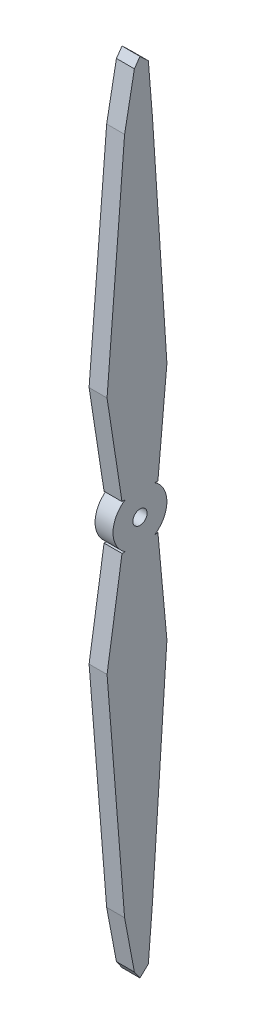
ISO-10303-21;
HEADER;
FILE_DESCRIPTION(('STEP AP214'),'2;1');
FILE_NAME('part.step','',(''),(''),'','','');
FILE_SCHEMA(('AUTOMOTIVE_DESIGN { 1 0 10303 214 1 1 1 1 }'));
ENDSEC;
DATA;
#1=APPLICATION_CONTEXT('core data for automotive mechanical design processes');
#2=APPLICATION_PROTOCOL_DEFINITION('international standard','automotive_design',2000,#1);
#3=PRODUCT_CONTEXT('',#1,'mechanical');
#4=PRODUCT('Part','Part','',(#3));
#5=PRODUCT_RELATED_PRODUCT_CATEGORY('part','',(#4));
#6=PRODUCT_DEFINITION_FORMATION('','',#4);
#7=PRODUCT_DEFINITION_CONTEXT('part definition',#1,'design');
#8=PRODUCT_DEFINITION('design','',#6,#7);
#9=PRODUCT_DEFINITION_SHAPE('','',#8);
#10=(LENGTH_UNIT() NAMED_UNIT(*) SI_UNIT(.MILLI.,.METRE.));
#11=(NAMED_UNIT(*) PLANE_ANGLE_UNIT() SI_UNIT($,.RADIAN.));
#12=(NAMED_UNIT(*) SI_UNIT($,.STERADIAN.) SOLID_ANGLE_UNIT());
#13=UNCERTAINTY_MEASURE_WITH_UNIT(LENGTH_MEASURE(1.E-05),#10,'distance_accuracy_value','');
#14=(GEOMETRIC_REPRESENTATION_CONTEXT(3) GLOBAL_UNCERTAINTY_ASSIGNED_CONTEXT((#13)) GLOBAL_UNIT_ASSIGNED_CONTEXT((#10,
#11,#12)) REPRESENTATION_CONTEXT('',''));
#15=CARTESIAN_POINT('',(0.,0.,0.));
#16=DIRECTION('',(0.,0.,1.));
#17=DIRECTION('',(1.,0.,0.));
#18=AXIS2_PLACEMENT_3D('',#15,#16,#17);
#19=CARTESIAN_POINT('',(-8.,0.,0.));
#20=DIRECTION('',(1.,0.,0.));
#21=DIRECTION('',(0.,0.,-1.));
#22=AXIS2_PLACEMENT_3D('',#19,#20,#21);
#23=CYLINDRICAL_SURFACE('',#22,12.);
#24=DIRECTION('',(1.,0.,0.));
#25=VECTOR('',#24,1.);
#26=CARTESIAN_POINT('',(-8.,-10.,6.6332495807108));
#27=LINE('',#26,#25);
#28=CARTESIAN_POINT('',(0.,-10.,6.6332495807108));
#29=VERTEX_POINT('',#28);
#30=CARTESIAN_POINT('',(-8.,-10.,6.6332495807108));
#31=VERTEX_POINT('',#30);
#32=EDGE_CURVE('E11',#29,#31,#27,.F.);
#33=ORIENTED_EDGE('',*,*,#32,.F.);
#34=CARTESIAN_POINT('',(0.,0.,0.));
#35=DIRECTION('',(1.,0.,0.));
#36=DIRECTION('',(0.,0.,-1.));
#37=AXIS2_PLACEMENT_3D('',#34,#35,#36);
#38=CIRCLE('',#37,12.);
#39=CARTESIAN_POINT('',(0.,10.,6.6332495807108));
#40=VERTEX_POINT('',#39);
#41=EDGE_CURVE('E259',#40,#29,#38,.T.);
#42=ORIENTED_EDGE('',*,*,#41,.F.);
#43=DIRECTION('',(1.,0.,0.));
#44=VECTOR('',#43,1.);
#45=CARTESIAN_POINT('',(-8.,10.,6.6332495807108));
#46=LINE('',#45,#44);
#47=CARTESIAN_POINT('',(-8.,10.,6.6332495807108));
#48=VERTEX_POINT('',#47);
#49=EDGE_CURVE('E257',#40,#48,#46,.F.);
#50=ORIENTED_EDGE('',*,*,#49,.T.);
#51=CARTESIAN_POINT('',(-8.,0.,0.));
#52=DIRECTION('',(1.,0.,0.));
#53=DIRECTION('',(0.,0.,-1.));
#54=AXIS2_PLACEMENT_3D('',#51,#52,#53);
#55=CIRCLE('',#54,12.);
#56=EDGE_CURVE('E254',#48,#31,#55,.T.);
#57=ORIENTED_EDGE('',*,*,#56,.T.);
#58=EDGE_LOOP('',(#33,#42,#50,#57));
#59=FACE_BOUND('',#58,.T.);
#60=ADVANCED_FACE('F39',(#59),#23,.T.);
#61=CARTESIAN_POINT('',(-8.,10.,-8.001));
#62=DIRECTION('',(0.,-1.,0.));
#63=DIRECTION('',(0.,0.,-1.));
#64=AXIS2_PLACEMENT_3D('',#61,#62,#63);
#65=PLANE('',#64);
#66=DIRECTION('',(1.,0.,0.));
#67=VECTOR('',#66,1.);
#68=CARTESIAN_POINT('',(-8.,10.,-6.6332495807108));
#69=LINE('',#68,#67);
#70=CARTESIAN_POINT('',(-8.,10.,-6.6332495807108));
#71=VERTEX_POINT('',#70);
#72=CARTESIAN_POINT('',(0.,10.,-6.6332495807108));
#73=VERTEX_POINT('',#72);
#74=EDGE_CURVE('E262',#71,#73,#69,.T.);
#75=ORIENTED_EDGE('',*,*,#74,.F.);
#76=DIRECTION('',(0.,0.,-1.));
#77=VECTOR('',#76,1.);
#78=CARTESIAN_POINT('',(-8.,10.,-8.001));
#79=LINE('',#78,#77);
#80=CARTESIAN_POINT('',(-8.,10.,-8.001));
#81=VERTEX_POINT('',#80);
#82=EDGE_CURVE('E269',#71,#81,#79,.T.);
#83=ORIENTED_EDGE('',*,*,#82,.T.);
#84=DIRECTION('',(1.,0.,0.));
#85=VECTOR('',#84,1.);
#86=CARTESIAN_POINT('',(-8.,10.,-8.001));
#87=LINE('',#86,#85);
#88=CARTESIAN_POINT('',(0.,10.,-8.001));
#89=VERTEX_POINT('',#88);
#90=EDGE_CURVE('E293',#81,#89,#87,.T.);
#91=ORIENTED_EDGE('',*,*,#90,.T.);
#92=DIRECTION('',(0.,0.,-1.));
#93=VECTOR('',#92,1.);
#94=CARTESIAN_POINT('',(0.,10.,-8.001));
#95=LINE('',#94,#93);
#96=EDGE_CURVE('E264',#73,#89,#95,.T.);
#97=ORIENTED_EDGE('',*,*,#96,.F.);
#98=EDGE_LOOP('',(#75,#83,#91,#97));
#99=FACE_BOUND('',#98,.T.);
#100=ADVANCED_FACE('F344',(#99),#65,.T.);
#101=ORIENTED_EDGE('',*,*,#49,.F.);
#102=CARTESIAN_POINT('',(0.,10.,8.001));
#103=VERTEX_POINT('',#102);
#104=EDGE_CURVE('E294',#103,#40,#95,.T.);
#105=ORIENTED_EDGE('',*,*,#104,.F.);
#106=DIRECTION('',(1.,0.,0.));
#107=VECTOR('',#106,1.);
#108=CARTESIAN_POINT('',(-8.,10.,8.001));
#109=LINE('',#108,#107);
#110=CARTESIAN_POINT('',(-8.,10.,8.001));
#111=VERTEX_POINT('',#110);
#112=EDGE_CURVE('E321',#111,#103,#109,.T.);
#113=ORIENTED_EDGE('',*,*,#112,.F.);
#114=EDGE_CURVE('E265',#111,#48,#79,.T.);
#115=ORIENTED_EDGE('',*,*,#114,.T.);
#116=EDGE_LOOP('',(#101,#105,#113,#115));
#117=FACE_BOUND('',#116,.T.);
#118=ADVANCED_FACE('F41',(#117),#65,.T.);
#119=CARTESIAN_POINT('',(-8.,10.,8.001));
#120=DIRECTION('',(0.,-0.152052900060362,0.988372356747817));
#121=DIRECTION('',(0.,-0.988372356747817,-0.152052900060362));
#122=AXIS2_PLACEMENT_3D('',#119,#120,#121);
#123=PLANE('',#122);
#124=DIRECTION('',(0.,-0.988372356747817,-0.152052900060362));
#125=VECTOR('',#124,1.);
#126=CARTESIAN_POINT('',(0.,10.,8.001));
#127=LINE('',#126,#125);
#128=CARTESIAN_POINT('',(0.,53.34,14.6685));
#129=VERTEX_POINT('',#128);
#130=EDGE_CURVE('E318',#129,#103,#127,.T.);
#131=ORIENTED_EDGE('',*,*,#130,.F.);
#132=DIRECTION('',(1.,0.,0.));
#133=VECTOR('',#132,1.);
#134=CARTESIAN_POINT('',(-8.,53.34,14.6685));
#135=LINE('',#134,#133);
#136=CARTESIAN_POINT('',(-8.,53.34,14.6685));
#137=VERTEX_POINT('',#136);
#138=EDGE_CURVE('E323',#137,#129,#135,.T.);
#139=ORIENTED_EDGE('',*,*,#138,.F.);
#140=DIRECTION('',(0.,-0.988372356747817,-0.152052900060362));
#141=VECTOR('',#140,1.);
#142=CARTESIAN_POINT('',(-8.,10.,8.001));
#143=LINE('',#142,#141);
#144=EDGE_CURVE('E290',#137,#111,#143,.T.);
#145=ORIENTED_EDGE('',*,*,#144,.T.);
#146=ORIENTED_EDGE('',*,*,#112,.T.);
#147=EDGE_LOOP('',(#131,#139,#145,#146));
#148=FACE_BOUND('',#147,.T.);
#149=ADVANCED_FACE('F375',(#148),#123,.T.);
#150=CARTESIAN_POINT('',(-8.,53.34,14.6685));
#151=DIRECTION('',(0.,0.07974522228289,0.996815278536125));
#152=DIRECTION('',(0.,-0.996815278536125,0.07974522228289));
#153=AXIS2_PLACEMENT_3D('',#150,#151,#152);
#154=PLANE('',#153);
#155=DIRECTION('',(0.,-0.996815278536125,0.07974522228289));
#156=VECTOR('',#155,1.);
#157=CARTESIAN_POINT('',(0.,53.34,14.6685));
#158=LINE('',#157,#156);
#159=CARTESIAN_POINT('',(0.,151.13,6.8453));
#160=VERTEX_POINT('',#159);
#161=EDGE_CURVE('E315',#160,#129,#158,.T.);
#162=ORIENTED_EDGE('',*,*,#161,.F.);
#163=DIRECTION('',(1.,0.,0.));
#164=VECTOR('',#163,1.);
#165=CARTESIAN_POINT('',(-8.,151.13,6.8453));
#166=LINE('',#165,#164);
#167=CARTESIAN_POINT('',(-8.,151.13,6.8453));
#168=VERTEX_POINT('',#167);
#169=EDGE_CURVE('E325',#168,#160,#166,.T.);
#170=ORIENTED_EDGE('',*,*,#169,.F.);
#171=DIRECTION('',(0.,-0.996815278536125,0.07974522228289));
#172=VECTOR('',#171,1.);
#173=CARTESIAN_POINT('',(-8.,53.34,14.6685));
#174=LINE('',#173,#172);
#175=EDGE_CURVE('E287',#168,#137,#174,.T.);
#176=ORIENTED_EDGE('',*,*,#175,.T.);
#177=ORIENTED_EDGE('',*,*,#138,.T.);
#178=EDGE_LOOP('',(#162,#170,#176,#177));
#179=FACE_BOUND('',#178,.T.);
#180=ADVANCED_FACE('F372',(#179),#154,.T.);
#181=CARTESIAN_POINT('',(-8.,151.13,6.8453));
#182=DIRECTION('',(0.,0.185201268913039,0.982700610558984));
#183=DIRECTION('',(0.,-0.982700610558984,0.185201268913039));
#184=AXIS2_PLACEMENT_3D('',#181,#182,#183);
#185=PLANE('',#184);
#186=DIRECTION('',(0.,-0.982700610558984,0.185201268913039));
#187=VECTOR('',#186,1.);
#188=CARTESIAN_POINT('',(0.,151.13,6.8453));
#189=LINE('',#188,#187);
#190=CARTESIAN_POINT('',(0.,174.244,2.4892));
#191=VERTEX_POINT('',#190);
#192=EDGE_CURVE('E312',#191,#160,#189,.T.);
#193=ORIENTED_EDGE('',*,*,#192,.F.);
#194=DIRECTION('',(1.,0.,0.));
#195=VECTOR('',#194,1.);
#196=CARTESIAN_POINT('',(-8.,174.244,2.4892));
#197=LINE('',#196,#195);
#198=CARTESIAN_POINT('',(-8.,174.244,2.4892));
#199=VERTEX_POINT('',#198);
#200=EDGE_CURVE('E327',#199,#191,#197,.T.);
#201=ORIENTED_EDGE('',*,*,#200,.F.);
#202=DIRECTION('',(0.,-0.982700610558984,0.185201268913039));
#203=VECTOR('',#202,1.);
#204=CARTESIAN_POINT('',(-8.,151.13,6.8453));
#205=LINE('',#204,#203);
#206=EDGE_CURVE('E284',#199,#168,#205,.T.);
#207=ORIENTED_EDGE('',*,*,#206,.T.);
#208=ORIENTED_EDGE('',*,*,#169,.T.);
#209=EDGE_LOOP('',(#193,#201,#207,#208));
#210=FACE_BOUND('',#209,.T.);
#211=ADVANCED_FACE('F368',(#210),#185,.T.);
#212=CARTESIAN_POINT('',(-8.,174.244,2.4892));
#213=DIRECTION('',(0.,0.573462344363328,0.819231920519041));
#214=DIRECTION('',(0.,-0.819231920519041,0.573462344363328));
#215=AXIS2_PLACEMENT_3D('',#212,#213,#214);
#216=PLANE('',#215);
#217=DIRECTION('',(0.,-0.819231920519041,0.573462344363328));
#218=VECTOR('',#217,1.);
#219=CARTESIAN_POINT('',(0.,174.244,2.4892));
#220=LINE('',#219,#218);
#221=CARTESIAN_POINT('',(0.,177.8,0.));
#222=VERTEX_POINT('',#221);
#223=EDGE_CURVE('E309',#222,#191,#220,.T.);
#224=ORIENTED_EDGE('',*,*,#223,.F.);
#225=DIRECTION('',(1.,0.,0.));
#226=VECTOR('',#225,1.);
#227=CARTESIAN_POINT('',(-8.,177.8,0.));
#228=LINE('',#227,#226);
#229=CARTESIAN_POINT('',(-8.,177.8,0.));
#230=VERTEX_POINT('',#229);
#231=EDGE_CURVE('E329',#230,#222,#228,.T.);
#232=ORIENTED_EDGE('',*,*,#231,.F.);
#233=DIRECTION('',(0.,-0.819231920519041,0.573462344363328));
#234=VECTOR('',#233,1.);
#235=CARTESIAN_POINT('',(-8.,174.244,2.4892));
#236=LINE('',#235,#234);
#237=EDGE_CURVE('E281',#230,#199,#236,.T.);
#238=ORIENTED_EDGE('',*,*,#237,.T.);
#239=ORIENTED_EDGE('',*,*,#200,.T.);
#240=EDGE_LOOP('',(#224,#232,#238,#239));
#241=FACE_BOUND('',#240,.T.);
#242=ADVANCED_FACE('F364',(#241),#216,.T.);
#243=CARTESIAN_POINT('',(-8.,177.8,0.));
#244=DIRECTION('',(0.,0.724137931034483,-0.689655172413793));
#245=DIRECTION('',(0.,0.689655172413793,0.724137931034483));
#246=AXIS2_PLACEMENT_3D('',#243,#244,#245);
#247=PLANE('',#246);
#248=DIRECTION('',(0.,0.689655172413793,0.724137931034482));
#249=VECTOR('',#248,1.);
#250=CARTESIAN_POINT('',(0.,177.8,0.));
#251=LINE('',#250,#249);
#252=CARTESIAN_POINT('',(0.,174.244,-3.7338));
#253=VERTEX_POINT('',#252);
#254=EDGE_CURVE('E306',#253,#222,#251,.T.);
#255=ORIENTED_EDGE('',*,*,#254,.F.);
#256=DIRECTION('',(1.,0.,0.));
#257=VECTOR('',#256,1.);
#258=CARTESIAN_POINT('',(-8.,174.244,-3.7338));
#259=LINE('',#258,#257);
#260=CARTESIAN_POINT('',(-8.,174.244,-3.7338));
#261=VERTEX_POINT('',#260);
#262=EDGE_CURVE('E331',#261,#253,#259,.T.);
#263=ORIENTED_EDGE('',*,*,#262,.F.);
#264=DIRECTION('',(0.,0.689655172413793,0.724137931034482));
#265=VECTOR('',#264,1.);
#266=CARTESIAN_POINT('',(-8.,177.8,0.));
#267=LINE('',#266,#265);
#268=EDGE_CURVE('E278',#261,#230,#267,.T.);
#269=ORIENTED_EDGE('',*,*,#268,.T.);
#270=ORIENTED_EDGE('',*,*,#231,.T.);
#271=EDGE_LOOP('',(#255,#263,#269,#270));
#272=FACE_BOUND('',#271,.T.);
#273=ADVANCED_FACE('F360',(#272),#247,.T.);
#274=CARTESIAN_POINT('',(-8.,174.244,-3.7338));
#275=DIRECTION('',(0.,0.0805070569764701,-0.996754038756296));
#276=DIRECTION('',(0.,0.996754038756296,0.0805070569764701));
#277=AXIS2_PLACEMENT_3D('',#274,#275,#276);
#278=PLANE('',#277);
#279=DIRECTION('',(0.,0.996754038756296,0.0805070569764701));
#280=VECTOR('',#279,1.);
#281=CARTESIAN_POINT('',(0.,174.244,-3.7338));
#282=LINE('',#281,#280);
#283=CARTESIAN_POINT('',(0.,151.13,-5.6007));
#284=VERTEX_POINT('',#283);
#285=EDGE_CURVE('E303',#284,#253,#282,.T.);
#286=ORIENTED_EDGE('',*,*,#285,.F.);
#287=DIRECTION('',(1.,0.,0.));
#288=VECTOR('',#287,1.);
#289=CARTESIAN_POINT('',(-8.,151.13,-5.6007));
#290=LINE('',#289,#288);
#291=CARTESIAN_POINT('',(-8.,151.13,-5.6007));
#292=VERTEX_POINT('',#291);
#293=EDGE_CURVE('E333',#292,#284,#290,.T.);
#294=ORIENTED_EDGE('',*,*,#293,.F.);
#295=DIRECTION('',(0.,0.996754038756296,0.0805070569764701));
#296=VECTOR('',#295,1.);
#297=CARTESIAN_POINT('',(-8.,174.244,-3.7338));
#298=LINE('',#297,#296);
#299=EDGE_CURVE('E275',#292,#261,#298,.T.);
#300=ORIENTED_EDGE('',*,*,#299,.T.);
#301=ORIENTED_EDGE('',*,*,#262,.T.);
#302=EDGE_LOOP('',(#286,#294,#300,#301));
#303=FACE_BOUND('',#302,.T.);
#304=ADVANCED_FACE('F356',(#303),#278,.T.);
#305=CARTESIAN_POINT('',(-8.,151.13,-5.6007));
#306=DIRECTION('',(0.,0.0653147810154766,-0.99786470995867));
#307=DIRECTION('',(0.,0.99786470995867,0.0653147810154766));
#308=AXIS2_PLACEMENT_3D('',#305,#306,#307);
#309=PLANE('',#308);
#310=DIRECTION('',(0.,0.99786470995867,0.0653147810154766));
#311=VECTOR('',#310,1.);
#312=CARTESIAN_POINT('',(0.,151.13,-5.6007));
#313=LINE('',#312,#311);
#314=CARTESIAN_POINT('',(0.,53.34,-12.0015));
#315=VERTEX_POINT('',#314);
#316=EDGE_CURVE('E300',#315,#284,#313,.T.);
#317=ORIENTED_EDGE('',*,*,#316,.F.);
#318=DIRECTION('',(1.,0.,0.));
#319=VECTOR('',#318,1.);
#320=CARTESIAN_POINT('',(-8.,53.34,-12.0015));
#321=LINE('',#320,#319);
#322=CARTESIAN_POINT('',(-8.,53.34,-12.0015));
#323=VERTEX_POINT('',#322);
#324=EDGE_CURVE('E335',#323,#315,#321,.T.);
#325=ORIENTED_EDGE('',*,*,#324,.F.);
#326=DIRECTION('',(0.,0.99786470995867,0.0653147810154766));
#327=VECTOR('',#326,1.);
#328=CARTESIAN_POINT('',(-8.,151.13,-5.6007));
#329=LINE('',#328,#327);
#330=EDGE_CURVE('E272',#323,#292,#329,.T.);
#331=ORIENTED_EDGE('',*,*,#330,.T.);
#332=ORIENTED_EDGE('',*,*,#293,.T.);
#333=EDGE_LOOP('',(#317,#325,#331,#332));
#334=FACE_BOUND('',#333,.T.);
#335=ADVANCED_FACE('F352',(#334),#309,.T.);
#336=CARTESIAN_POINT('',(-8.,53.34,-12.0015));
#337=DIRECTION('',(0.,-0.0919142955721114,-0.995766921658619));
#338=DIRECTION('',(0.,0.995766921658619,-0.0919142955721114));
#339=AXIS2_PLACEMENT_3D('',#336,#337,#338);
#340=PLANE('',#339);
#341=DIRECTION('',(0.,0.995766921658619,-0.0919142955721114));
#342=VECTOR('',#341,1.);
#343=CARTESIAN_POINT('',(0.,53.34,-12.0015));
#344=LINE('',#343,#342);
#345=EDGE_CURVE('E297',#89,#315,#344,.T.);
#346=ORIENTED_EDGE('',*,*,#345,.F.);
#347=ORIENTED_EDGE('',*,*,#90,.F.);
#348=DIRECTION('',(0.,0.995766921658619,-0.0919142955721114));
#349=VECTOR('',#348,1.);
#350=CARTESIAN_POINT('',(-8.,53.34,-12.0015));
#351=LINE('',#350,#349);
#352=EDGE_CURVE('E268',#81,#323,#351,.T.);
#353=ORIENTED_EDGE('',*,*,#352,.T.);
#354=ORIENTED_EDGE('',*,*,#324,.T.);
#355=EDGE_LOOP('',(#346,#347,#353,#354));
#356=FACE_BOUND('',#355,.T.);
#357=ADVANCED_FACE('F348',(#356),#340,.T.);
#358=CARTESIAN_POINT('',(-8.,0.,0.));
#359=DIRECTION('',(1.,0.,0.));
#360=DIRECTION('',(0.,0.,-1.));
#361=AXIS2_PLACEMENT_3D('',#358,#359,#360);
#362=PLANE('',#361);
#363=CARTESIAN_POINT('',(-8.,0.,0.));
#364=DIRECTION('',(1.,0.,0.));
#365=DIRECTION('',(0.,0.,-1.));
#366=AXIS2_PLACEMENT_3D('',#363,#364,#365);
#367=CIRCLE('',#366,3.175);
#368=CARTESIAN_POINT('',(-8.,0.,-3.175));
#369=VERTEX_POINT('',#368);
#370=EDGE_CURVE('E404',#369,#369,#367,.T.);
#371=ORIENTED_EDGE('',*,*,#370,.T.);
#372=EDGE_LOOP('',(#371));
#373=FACE_BOUND('',#372,.T.);
#374=CARTESIAN_POINT('',(-8.,-10.,-6.6332495807108));
#375=VERTEX_POINT('',#374);
#376=EDGE_CURVE('E258',#375,#71,#55,.T.);
#377=ORIENTED_EDGE('',*,*,#376,.F.);
#378=DIRECTION('',(0.,0.,1.));
#379=VECTOR('',#378,1.);
#380=CARTESIAN_POINT('',(-8.,-10.,-8.001));
#381=LINE('',#380,#379);
#382=CARTESIAN_POINT('',(-8.,-10.,-8.001));
#383=VERTEX_POINT('',#382);
#384=EDGE_CURVE('E207',#383,#375,#381,.T.);
#385=ORIENTED_EDGE('',*,*,#384,.F.);
#386=DIRECTION('',(0.,0.995766921658619,0.0919142955721114));
#387=VECTOR('',#386,1.);
#388=CARTESIAN_POINT('',(-8.,-53.34,-12.0015));
#389=LINE('',#388,#387);
#390=CARTESIAN_POINT('',(-8.,-53.34,-12.0015));
#391=VERTEX_POINT('',#390);
#392=EDGE_CURVE('E192',#391,#383,#389,.T.);
#393=ORIENTED_EDGE('',*,*,#392,.F.);
#394=DIRECTION('',(0.,0.99786470995867,-0.0653147810154766));
#395=VECTOR('',#394,1.);
#396=CARTESIAN_POINT('',(-8.,-151.13,-5.6007));
#397=LINE('',#396,#395);
#398=CARTESIAN_POINT('',(-8.,-151.13,-5.6007));
#399=VERTEX_POINT('',#398);
#400=EDGE_CURVE('E232',#399,#391,#397,.T.);
#401=ORIENTED_EDGE('',*,*,#400,.F.);
#402=DIRECTION('',(0.,0.996754038756296,-0.0805070569764701));
#403=VECTOR('',#402,1.);
#404=CARTESIAN_POINT('',(-8.,-174.244,-3.7338));
#405=LINE('',#404,#403);
#406=CARTESIAN_POINT('',(-8.,-174.244,-3.7338));
#407=VERTEX_POINT('',#406);
#408=EDGE_CURVE('E236',#407,#399,#405,.T.);
#409=ORIENTED_EDGE('',*,*,#408,.F.);
#410=DIRECTION('',(0.,0.689655172413793,-0.724137931034482));
#411=VECTOR('',#410,1.);
#412=CARTESIAN_POINT('',(-8.,-177.8,0.));
#413=LINE('',#412,#411);
#414=CARTESIAN_POINT('',(-8.,-177.8,0.));
#415=VERTEX_POINT('',#414);
#416=EDGE_CURVE('E239',#415,#407,#413,.T.);
#417=ORIENTED_EDGE('',*,*,#416,.F.);
#418=DIRECTION('',(0.,-0.819231920519041,-0.573462344363328));
#419=VECTOR('',#418,1.);
#420=CARTESIAN_POINT('',(-8.,-174.244,2.4892));
#421=LINE('',#420,#419);
#422=CARTESIAN_POINT('',(-8.,-174.244,2.4892));
#423=VERTEX_POINT('',#422);
#424=EDGE_CURVE('E242',#423,#415,#421,.T.);
#425=ORIENTED_EDGE('',*,*,#424,.F.);
#426=DIRECTION('',(0.,-0.982700610558984,-0.185201268913039));
#427=VECTOR('',#426,1.);
#428=CARTESIAN_POINT('',(-8.,-151.13,6.8453));
#429=LINE('',#428,#427);
#430=CARTESIAN_POINT('',(-8.,-151.13,6.8453));
#431=VERTEX_POINT('',#430);
#432=EDGE_CURVE('E245',#431,#423,#429,.T.);
#433=ORIENTED_EDGE('',*,*,#432,.F.);
#434=DIRECTION('',(0.,-0.996815278536125,-0.07974522228289));
#435=VECTOR('',#434,1.);
#436=CARTESIAN_POINT('',(-8.,-53.34,14.6685));
#437=LINE('',#436,#435);
#438=CARTESIAN_POINT('',(-8.,-53.34,14.6685));
#439=VERTEX_POINT('',#438);
#440=EDGE_CURVE('E248',#439,#431,#437,.T.);
#441=ORIENTED_EDGE('',*,*,#440,.F.);
#442=DIRECTION('',(0.,-0.988372356747817,0.152052900060362));
#443=VECTOR('',#442,1.);
#444=CARTESIAN_POINT('',(-8.,-10.,8.001));
#445=LINE('',#444,#443);
#446=CARTESIAN_POINT('',(-8.,-10.,8.001));
#447=VERTEX_POINT('',#446);
#448=EDGE_CURVE('E251',#447,#439,#445,.T.);
#449=ORIENTED_EDGE('',*,*,#448,.F.);
#450=EDGE_CURVE('E211',#31,#447,#381,.T.);
#451=ORIENTED_EDGE('',*,*,#450,.F.);
#452=ORIENTED_EDGE('',*,*,#56,.F.);
#453=ORIENTED_EDGE('',*,*,#114,.F.);
#454=ORIENTED_EDGE('',*,*,#144,.F.);
#455=ORIENTED_EDGE('',*,*,#175,.F.);
#456=ORIENTED_EDGE('',*,*,#206,.F.);
#457=ORIENTED_EDGE('',*,*,#237,.F.);
#458=ORIENTED_EDGE('',*,*,#268,.F.);
#459=ORIENTED_EDGE('',*,*,#299,.F.);
#460=ORIENTED_EDGE('',*,*,#330,.F.);
#461=ORIENTED_EDGE('',*,*,#352,.F.);
#462=ORIENTED_EDGE('',*,*,#82,.F.);
#463=EDGE_LOOP('',(#377,#385,#393,#401,#409,#417,#425,#433,#441,#449,#451,#452,#453,#454,#455,
#456,#457,#458,#459,#460,#461,#462));
#464=FACE_BOUND('',#463,.T.);
#465=ADVANCED_FACE('F392',(#373,#464),#362,.F.);
#466=CARTESIAN_POINT('',(0.,0.,0.));
#467=DIRECTION('',(1.,0.,0.));
#468=DIRECTION('',(0.,0.,-1.));
#469=AXIS2_PLACEMENT_3D('',#466,#467,#468);
#470=PLANE('',#469);
#471=CARTESIAN_POINT('',(0.,0.,0.));
#472=DIRECTION('',(1.,0.,0.));
#473=DIRECTION('',(0.,0.,-1.));
#474=AXIS2_PLACEMENT_3D('',#471,#472,#473);
#475=CIRCLE('',#474,3.175);
#476=CARTESIAN_POINT('',(0.,0.,-3.175));
#477=VERTEX_POINT('',#476);
#478=EDGE_CURVE('E43',#477,#477,#475,.T.);
#479=ORIENTED_EDGE('',*,*,#478,.F.);
#480=EDGE_LOOP('',(#479));
#481=FACE_BOUND('',#480,.T.);
#482=ORIENTED_EDGE('',*,*,#41,.T.);
#483=DIRECTION('',(0.,0.,1.));
#484=VECTOR('',#483,1.);
#485=CARTESIAN_POINT('',(0.,-10.,-8.001));
#486=LINE('',#485,#484);
#487=CARTESIAN_POINT('',(0.,-10.,8.001));
#488=VERTEX_POINT('',#487);
#489=EDGE_CURVE('E199',#29,#488,#486,.T.);
#490=ORIENTED_EDGE('',*,*,#489,.T.);
#491=DIRECTION('',(0.,-0.988372356747817,0.152052900060362));
#492=VECTOR('',#491,1.);
#493=CARTESIAN_POINT('',(0.,-10.,8.001));
#494=LINE('',#493,#492);
#495=CARTESIAN_POINT('',(0.,-53.34,14.6685));
#496=VERTEX_POINT('',#495);
#497=EDGE_CURVE('E228',#488,#496,#494,.T.);
#498=ORIENTED_EDGE('',*,*,#497,.T.);
#499=DIRECTION('',(0.,-0.996815278536125,-0.07974522228289));
#500=VECTOR('',#499,1.);
#501=CARTESIAN_POINT('',(0.,-53.34,14.6685));
#502=LINE('',#501,#500);
#503=CARTESIAN_POINT('',(0.,-151.13,6.8453));
#504=VERTEX_POINT('',#503);
#505=EDGE_CURVE('E225',#496,#504,#502,.T.);
#506=ORIENTED_EDGE('',*,*,#505,.T.);
#507=DIRECTION('',(0.,-0.982700610558984,-0.185201268913039));
#508=VECTOR('',#507,1.);
#509=CARTESIAN_POINT('',(0.,-151.13,6.8453));
#510=LINE('',#509,#508);
#511=CARTESIAN_POINT('',(0.,-174.244,2.4892));
#512=VERTEX_POINT('',#511);
#513=EDGE_CURVE('E222',#504,#512,#510,.T.);
#514=ORIENTED_EDGE('',*,*,#513,.T.);
#515=DIRECTION('',(0.,-0.819231920519041,-0.573462344363328));
#516=VECTOR('',#515,1.);
#517=CARTESIAN_POINT('',(0.,-174.244,2.4892));
#518=LINE('',#517,#516);
#519=CARTESIAN_POINT('',(0.,-177.8,0.));
#520=VERTEX_POINT('',#519);
#521=EDGE_CURVE('E219',#512,#520,#518,.T.);
#522=ORIENTED_EDGE('',*,*,#521,.T.);
#523=DIRECTION('',(0.,0.689655172413793,-0.724137931034482));
#524=VECTOR('',#523,1.);
#525=CARTESIAN_POINT('',(0.,-177.8,0.));
#526=LINE('',#525,#524);
#527=CARTESIAN_POINT('',(0.,-174.244,-3.7338));
#528=VERTEX_POINT('',#527);
#529=EDGE_CURVE('E216',#520,#528,#526,.T.);
#530=ORIENTED_EDGE('',*,*,#529,.T.);
#531=DIRECTION('',(0.,0.996754038756296,-0.0805070569764701));
#532=VECTOR('',#531,1.);
#533=CARTESIAN_POINT('',(0.,-174.244,-3.7338));
#534=LINE('',#533,#532);
#535=CARTESIAN_POINT('',(0.,-151.13,-5.6007));
#536=VERTEX_POINT('',#535);
#537=EDGE_CURVE('E209',#528,#536,#534,.T.);
#538=ORIENTED_EDGE('',*,*,#537,.T.);
#539=DIRECTION('',(0.,0.99786470995867,-0.0653147810154766));
#540=VECTOR('',#539,1.);
#541=CARTESIAN_POINT('',(0.,-151.13,-5.6007));
#542=LINE('',#541,#540);
#543=CARTESIAN_POINT('',(0.,-53.34,-12.0015));
#544=VERTEX_POINT('',#543);
#545=EDGE_CURVE('E206',#536,#544,#542,.T.);
#546=ORIENTED_EDGE('',*,*,#545,.T.);
#547=DIRECTION('',(0.,0.995766921658619,0.0919142955721114));
#548=VECTOR('',#547,1.);
#549=CARTESIAN_POINT('',(0.,-53.34,-12.0015));
#550=LINE('',#549,#548);
#551=CARTESIAN_POINT('',(0.,-10.,-8.001));
#552=VERTEX_POINT('',#551);
#553=EDGE_CURVE('E190',#544,#552,#550,.T.);
#554=ORIENTED_EDGE('',*,*,#553,.T.);
#555=CARTESIAN_POINT('',(0.,-10.,-6.6332495807108));
#556=VERTEX_POINT('',#555);
#557=EDGE_CURVE('E55',#552,#556,#486,.T.);
#558=ORIENTED_EDGE('',*,*,#557,.T.);
#559=EDGE_CURVE('E60',#556,#73,#38,.T.);
#560=ORIENTED_EDGE('',*,*,#559,.T.);
#561=ORIENTED_EDGE('',*,*,#96,.T.);
#562=ORIENTED_EDGE('',*,*,#345,.T.);
#563=ORIENTED_EDGE('',*,*,#316,.T.);
#564=ORIENTED_EDGE('',*,*,#285,.T.);
#565=ORIENTED_EDGE('',*,*,#254,.T.);
#566=ORIENTED_EDGE('',*,*,#223,.T.);
#567=ORIENTED_EDGE('',*,*,#192,.T.);
#568=ORIENTED_EDGE('',*,*,#161,.T.);
#569=ORIENTED_EDGE('',*,*,#130,.T.);
#570=ORIENTED_EDGE('',*,*,#104,.T.);
#571=EDGE_LOOP('',(#482,#490,#498,#506,#514,#522,#530,#538,#546,#554,#558,#560,#561,#562,#563,
#564,#565,#566,#567,#568,#569,#570));
#572=FACE_BOUND('',#571,.T.);
#573=ADVANCED_FACE('F203',(#481,#572),#470,.T.);
#574=DIRECTION('',(1.,0.,0.));
#575=VECTOR('',#574,1.);
#576=CARTESIAN_POINT('',(-8.,-10.,-6.6332495807108));
#577=LINE('',#576,#575);
#578=EDGE_CURVE('E48',#375,#556,#577,.T.);
#579=ORIENTED_EDGE('',*,*,#578,.F.);
#580=ORIENTED_EDGE('',*,*,#376,.T.);
#581=ORIENTED_EDGE('',*,*,#74,.T.);
#582=ORIENTED_EDGE('',*,*,#559,.F.);
#583=EDGE_LOOP('',(#579,#580,#581,#582));
#584=FACE_BOUND('',#583,.T.);
#585=ADVANCED_FACE('F419',(#584),#23,.T.);
#586=CARTESIAN_POINT('',(-8.,-10.,-8.001));
#587=DIRECTION('',(0.,1.,0.));
#588=DIRECTION('',(0.,0.,1.));
#589=AXIS2_PLACEMENT_3D('',#586,#587,#588);
#590=PLANE('',#589);
#591=ORIENTED_EDGE('',*,*,#489,.F.);
#592=ORIENTED_EDGE('',*,*,#32,.T.);
#593=ORIENTED_EDGE('',*,*,#450,.T.);
#594=DIRECTION('',(1.,0.,0.));
#595=VECTOR('',#594,1.);
#596=CARTESIAN_POINT('',(-8.,-10.,8.001));
#597=LINE('',#596,#595);
#598=EDGE_CURVE('E233',#447,#488,#597,.T.);
#599=ORIENTED_EDGE('',*,*,#598,.T.);
#600=EDGE_LOOP('',(#591,#592,#593,#599));
#601=FACE_BOUND('',#600,.T.);
#602=ADVANCED_FACE('F387',(#601),#590,.T.);
#603=ORIENTED_EDGE('',*,*,#384,.T.);
#604=ORIENTED_EDGE('',*,*,#578,.T.);
#605=ORIENTED_EDGE('',*,*,#557,.F.);
#606=DIRECTION('',(1.,0.,0.));
#607=VECTOR('',#606,1.);
#608=CARTESIAN_POINT('',(-8.,-10.,-8.001));
#609=LINE('',#608,#607);
#610=EDGE_CURVE('E188',#383,#552,#609,.T.);
#611=ORIENTED_EDGE('',*,*,#610,.F.);
#612=EDGE_LOOP('',(#603,#604,#605,#611));
#613=FACE_BOUND('',#612,.T.);
#614=ADVANCED_FACE('F197',(#613),#590,.T.);
#615=CARTESIAN_POINT('',(-8.,-53.34,-12.0015));
#616=DIRECTION('',(0.,0.0919142955721114,-0.995766921658619));
#617=DIRECTION('',(0.,0.995766921658619,0.0919142955721114));
#618=AXIS2_PLACEMENT_3D('',#615,#616,#617);
#619=PLANE('',#618);
#620=ORIENTED_EDGE('',*,*,#553,.F.);
#621=DIRECTION('',(1.,0.,0.));
#622=VECTOR('',#621,1.);
#623=CARTESIAN_POINT('',(-8.,-53.34,-12.0015));
#624=LINE('',#623,#622);
#625=EDGE_CURVE('E195',#391,#544,#624,.T.);
#626=ORIENTED_EDGE('',*,*,#625,.F.);
#627=ORIENTED_EDGE('',*,*,#392,.T.);
#628=ORIENTED_EDGE('',*,*,#610,.T.);
#629=EDGE_LOOP('',(#620,#626,#627,#628));
#630=FACE_BOUND('',#629,.T.);
#631=ADVANCED_FACE('F189',(#630),#619,.T.);
#632=CARTESIAN_POINT('',(-8.,-151.13,-5.6007));
#633=DIRECTION('',(0.,-0.0653147810154766,-0.99786470995867));
#634=DIRECTION('',(0.,0.99786470995867,-0.0653147810154766));
#635=AXIS2_PLACEMENT_3D('',#632,#633,#634);
#636=PLANE('',#635);
#637=ORIENTED_EDGE('',*,*,#545,.F.);
#638=DIRECTION('',(1.,0.,0.));
#639=VECTOR('',#638,1.);
#640=CARTESIAN_POINT('',(-8.,-151.13,-5.6007));
#641=LINE('',#640,#639);
#642=EDGE_CURVE('E413',#399,#536,#641,.T.);
#643=ORIENTED_EDGE('',*,*,#642,.F.);
#644=ORIENTED_EDGE('',*,*,#400,.T.);
#645=ORIENTED_EDGE('',*,*,#625,.T.);
#646=EDGE_LOOP('',(#637,#643,#644,#645));
#647=FACE_BOUND('',#646,.T.);
#648=ADVANCED_FACE('F415',(#647),#636,.T.);
#649=CARTESIAN_POINT('',(-8.,-174.244,-3.7338));
#650=DIRECTION('',(0.,-0.0805070569764701,-0.996754038756296));
#651=DIRECTION('',(0.,0.996754038756296,-0.0805070569764701));
#652=AXIS2_PLACEMENT_3D('',#649,#650,#651);
#653=PLANE('',#652);
#654=ORIENTED_EDGE('',*,*,#537,.F.);
#655=DIRECTION('',(1.,0.,0.));
#656=VECTOR('',#655,1.);
#657=CARTESIAN_POINT('',(-8.,-174.244,-3.7338));
#658=LINE('',#657,#656);
#659=EDGE_CURVE('E411',#407,#528,#658,.T.);
#660=ORIENTED_EDGE('',*,*,#659,.F.);
#661=ORIENTED_EDGE('',*,*,#408,.T.);
#662=ORIENTED_EDGE('',*,*,#642,.T.);
#663=EDGE_LOOP('',(#654,#660,#661,#662));
#664=FACE_BOUND('',#663,.T.);
#665=ADVANCED_FACE('F493',(#664),#653,.T.);
#666=CARTESIAN_POINT('',(-8.,-177.8,0.));
#667=DIRECTION('',(0.,-0.724137931034483,-0.689655172413793));
#668=DIRECTION('',(0.,0.689655172413793,-0.724137931034483));
#669=AXIS2_PLACEMENT_3D('',#666,#667,#668);
#670=PLANE('',#669);
#671=ORIENTED_EDGE('',*,*,#529,.F.);
#672=DIRECTION('',(1.,0.,0.));
#673=VECTOR('',#672,1.);
#674=CARTESIAN_POINT('',(-8.,-177.8,0.));
#675=LINE('',#674,#673);
#676=EDGE_CURVE('E409',#415,#520,#675,.T.);
#677=ORIENTED_EDGE('',*,*,#676,.F.);
#678=ORIENTED_EDGE('',*,*,#416,.T.);
#679=ORIENTED_EDGE('',*,*,#659,.T.);
#680=EDGE_LOOP('',(#671,#677,#678,#679));
#681=FACE_BOUND('',#680,.T.);
#682=ADVANCED_FACE('F489',(#681),#670,.T.);
#683=CARTESIAN_POINT('',(-8.,-174.244,2.4892));
#684=DIRECTION('',(0.,-0.573462344363328,0.819231920519041));
#685=DIRECTION('',(0.,-0.819231920519041,-0.573462344363328));
#686=AXIS2_PLACEMENT_3D('',#683,#684,#685);
#687=PLANE('',#686);
#688=ORIENTED_EDGE('',*,*,#521,.F.);
#689=DIRECTION('',(1.,0.,0.));
#690=VECTOR('',#689,1.);
#691=CARTESIAN_POINT('',(-8.,-174.244,2.4892));
#692=LINE('',#691,#690);
#693=EDGE_CURVE('E407',#423,#512,#692,.T.);
#694=ORIENTED_EDGE('',*,*,#693,.F.);
#695=ORIENTED_EDGE('',*,*,#424,.T.);
#696=ORIENTED_EDGE('',*,*,#676,.T.);
#697=EDGE_LOOP('',(#688,#694,#695,#696));
#698=FACE_BOUND('',#697,.T.);
#699=ADVANCED_FACE('F485',(#698),#687,.T.);
#700=CARTESIAN_POINT('',(-8.,-151.13,6.8453));
#701=DIRECTION('',(0.,-0.185201268913039,0.982700610558984));
#702=DIRECTION('',(0.,-0.982700610558984,-0.185201268913039));
#703=AXIS2_PLACEMENT_3D('',#700,#701,#702);
#704=PLANE('',#703);
#705=ORIENTED_EDGE('',*,*,#513,.F.);
#706=DIRECTION('',(1.,0.,0.));
#707=VECTOR('',#706,1.);
#708=CARTESIAN_POINT('',(-8.,-151.13,6.8453));
#709=LINE('',#708,#707);
#710=EDGE_CURVE('E401',#431,#504,#709,.T.);
#711=ORIENTED_EDGE('',*,*,#710,.F.);
#712=ORIENTED_EDGE('',*,*,#432,.T.);
#713=ORIENTED_EDGE('',*,*,#693,.T.);
#714=EDGE_LOOP('',(#705,#711,#712,#713));
#715=FACE_BOUND('',#714,.T.);
#716=ADVANCED_FACE('F481',(#715),#704,.T.);
#717=CARTESIAN_POINT('',(-8.,-53.34,14.6685));
#718=DIRECTION('',(0.,-0.07974522228289,0.996815278536125));
#719=DIRECTION('',(0.,-0.996815278536125,-0.07974522228289));
#720=AXIS2_PLACEMENT_3D('',#717,#718,#719);
#721=PLANE('',#720);
#722=ORIENTED_EDGE('',*,*,#505,.F.);
#723=DIRECTION('',(1.,0.,0.));
#724=VECTOR('',#723,1.);
#725=CARTESIAN_POINT('',(-8.,-53.34,14.6685));
#726=LINE('',#725,#724);
#727=EDGE_CURVE('E398',#439,#496,#726,.T.);
#728=ORIENTED_EDGE('',*,*,#727,.F.);
#729=ORIENTED_EDGE('',*,*,#440,.T.);
#730=ORIENTED_EDGE('',*,*,#710,.T.);
#731=EDGE_LOOP('',(#722,#728,#729,#730));
#732=FACE_BOUND('',#731,.T.);
#733=ADVANCED_FACE('F475',(#732),#721,.T.);
#734=CARTESIAN_POINT('',(-8.,-10.,8.001));
#735=DIRECTION('',(0.,0.152052900060362,0.988372356747817));
#736=DIRECTION('',(0.,-0.988372356747817,0.152052900060362));
#737=AXIS2_PLACEMENT_3D('',#734,#735,#736);
#738=PLANE('',#737);
#739=ORIENTED_EDGE('',*,*,#497,.F.);
#740=ORIENTED_EDGE('',*,*,#598,.F.);
#741=ORIENTED_EDGE('',*,*,#448,.T.);
#742=ORIENTED_EDGE('',*,*,#727,.T.);
#743=EDGE_LOOP('',(#739,#740,#741,#742));
#744=FACE_BOUND('',#743,.T.);
#745=ADVANCED_FACE('F397',(#744),#738,.T.);
#746=CARTESIAN_POINT('',(-8.,0.,0.));
#747=DIRECTION('',(1.,0.,0.));
#748=DIRECTION('',(0.,0.,-1.));
#749=AXIS2_PLACEMENT_3D('',#746,#747,#748);
#750=CYLINDRICAL_SURFACE('',#749,3.175);
#751=ORIENTED_EDGE('',*,*,#478,.T.);
#752=EDGE_LOOP('',(#751));
#753=FACE_BOUND('',#752,.T.);
#754=ORIENTED_EDGE('',*,*,#370,.F.);
#755=EDGE_LOOP('',(#754));
#756=FACE_BOUND('',#755,.T.);
#757=ADVANCED_FACE('F470',(#753,#756),#750,.F.);
#758=CLOSED_SHELL('',(#60,#100,#118,#149,#180,#211,#242,#273,#304,#335,#357,#465,#573,#585,#602,
#614,#631,#648,#665,#682,#699,#716,#733,#745,#757));
#759=MANIFOLD_SOLID_BREP('B2',#758);
#760=ADVANCED_BREP_SHAPE_REPRESENTATION('',(#18,#759),#14);
#761=SHAPE_DEFINITION_REPRESENTATION(#9,#760);
ENDSEC;
END-ISO-10303-21;
